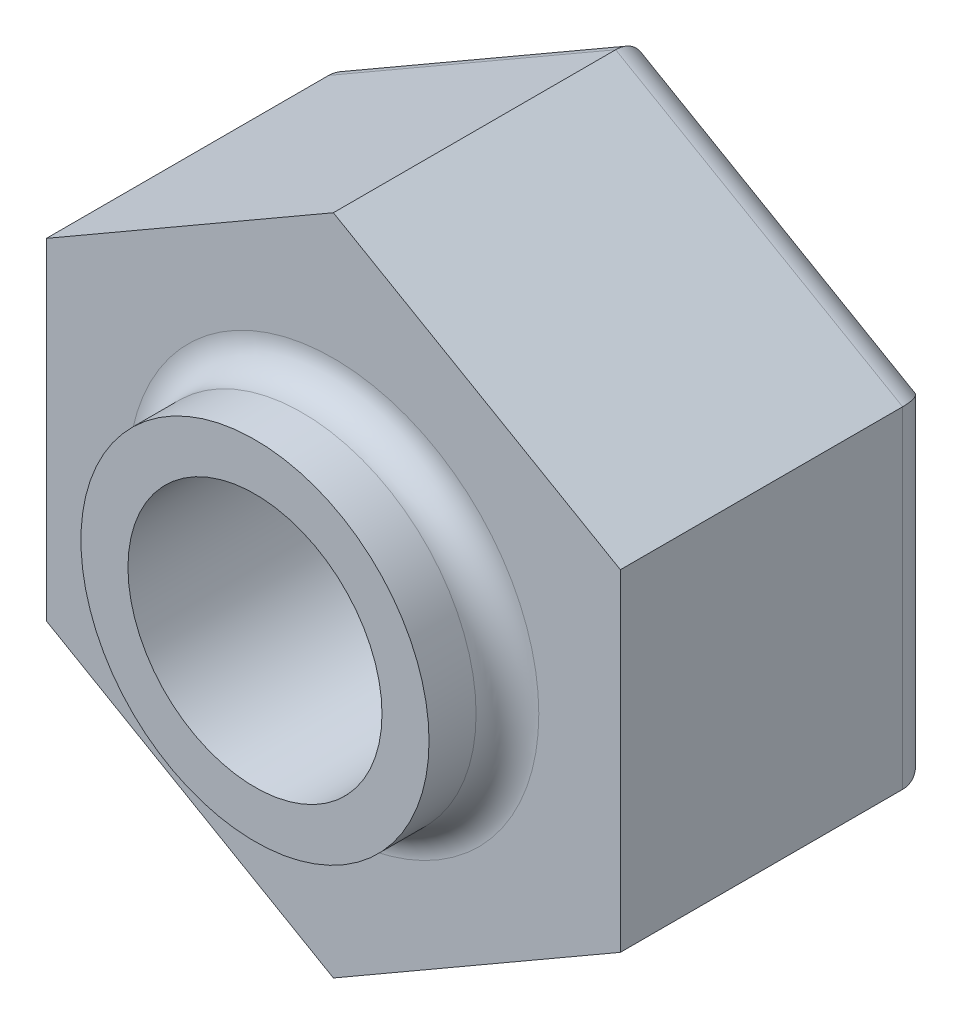
ISO-10303-21;
HEADER;
FILE_DESCRIPTION(('STEP AP214'),'2;1');
FILE_NAME('part.step','',(''),(''),'','','');
FILE_SCHEMA(('AUTOMOTIVE_DESIGN { 1 0 10303 214 1 1 1 1 }'));
ENDSEC;
DATA;
#1=APPLICATION_CONTEXT('core data for automotive mechanical design processes');
#2=APPLICATION_PROTOCOL_DEFINITION('international standard','automotive_design',2000,#1);
#3=PRODUCT_CONTEXT('',#1,'mechanical');
#4=PRODUCT('Part','Part','',(#3));
#5=PRODUCT_RELATED_PRODUCT_CATEGORY('part','',(#4));
#6=PRODUCT_DEFINITION_FORMATION('','',#4);
#7=PRODUCT_DEFINITION_CONTEXT('part definition',#1,'design');
#8=PRODUCT_DEFINITION('design','',#6,#7);
#9=PRODUCT_DEFINITION_SHAPE('','',#8);
#10=(LENGTH_UNIT() NAMED_UNIT(*) SI_UNIT(.MILLI.,.METRE.));
#11=(NAMED_UNIT(*) PLANE_ANGLE_UNIT() SI_UNIT($,.RADIAN.));
#12=(NAMED_UNIT(*) SI_UNIT($,.STERADIAN.) SOLID_ANGLE_UNIT());
#13=UNCERTAINTY_MEASURE_WITH_UNIT(LENGTH_MEASURE(1.E-05),#10,'distance_accuracy_value','');
#14=(GEOMETRIC_REPRESENTATION_CONTEXT(3) GLOBAL_UNCERTAINTY_ASSIGNED_CONTEXT((#13)) GLOBAL_UNIT_ASSIGNED_CONTEXT((#10,
#11,#12)) REPRESENTATION_CONTEXT('',''));
#15=CARTESIAN_POINT('',(0.,0.,0.));
#16=DIRECTION('',(0.,0.,1.));
#17=DIRECTION('',(1.,0.,0.));
#18=AXIS2_PLACEMENT_3D('',#15,#16,#17);
#19=CARTESIAN_POINT('',(0.,0.,10.));
#20=DIRECTION('',(0.,0.,1.));
#21=DIRECTION('',(1.,0.,0.));
#22=AXIS2_PLACEMENT_3D('',#19,#20,#21);
#23=PLANE('',#22);
#24=CARTESIAN_POINT('',(0.,0.,10.));
#25=DIRECTION('',(0.,0.,1.));
#26=DIRECTION('',(1.,0.,0.));
#27=AXIS2_PLACEMENT_3D('',#24,#25,#26);
#28=CIRCLE('',#27,6.55);
#29=CARTESIAN_POINT('',(6.55,0.,10.));
#30=VERTEX_POINT('',#29);
#31=EDGE_CURVE('E11',#30,#30,#28,.F.);
#32=ORIENTED_EDGE('',*,*,#31,.T.);
#33=EDGE_LOOP('',(#32));
#34=FACE_BOUND('',#33,.T.);
#35=DIRECTION('',(0.866025403784439,0.5,0.));
#36=VECTOR('',#35,1.);
#37=CARTESIAN_POINT('',(0.,-10.5655099261702,10.));
#38=LINE('',#37,#36);
#39=CARTESIAN_POINT('',(0.,-10.5655099261702,10.));
#40=VERTEX_POINT('',#39);
#41=CARTESIAN_POINT('',(9.15,-5.28275496308508,10.));
#42=VERTEX_POINT('',#41);
#43=EDGE_CURVE('E127',#40,#42,#38,.T.);
#44=ORIENTED_EDGE('',*,*,#43,.T.);
#45=DIRECTION('',(0.,1.,0.));
#46=VECTOR('',#45,1.);
#47=CARTESIAN_POINT('',(9.15,-5.28275496308508,10.));
#48=LINE('',#47,#46);
#49=CARTESIAN_POINT('',(9.15,5.28275496308508,10.));
#50=VERTEX_POINT('',#49);
#51=EDGE_CURVE('E115',#42,#50,#48,.T.);
#52=ORIENTED_EDGE('',*,*,#51,.T.);
#53=DIRECTION('',(-0.866025403784439,0.5,0.));
#54=VECTOR('',#53,1.);
#55=CARTESIAN_POINT('',(9.15,5.28275496308508,10.));
#56=LINE('',#55,#54);
#57=CARTESIAN_POINT('',(0.,10.5655099261702,10.));
#58=VERTEX_POINT('',#57);
#59=EDGE_CURVE('E126',#50,#58,#56,.T.);
#60=ORIENTED_EDGE('',*,*,#59,.T.);
#61=DIRECTION('',(-0.866025403784439,-0.5,0.));
#62=VECTOR('',#61,1.);
#63=CARTESIAN_POINT('',(0.,10.5655099261702,10.));
#64=LINE('',#63,#62);
#65=CARTESIAN_POINT('',(-9.15000000000001,5.28275496308508,10.));
#66=VERTEX_POINT('',#65);
#67=EDGE_CURVE('E201',#58,#66,#64,.T.);
#68=ORIENTED_EDGE('',*,*,#67,.T.);
#69=DIRECTION('',(0.,-1.,0.));
#70=VECTOR('',#69,1.);
#71=CARTESIAN_POINT('',(-9.15000000000001,5.28275496308508,10.));
#72=LINE('',#71,#70);
#73=CARTESIAN_POINT('',(-9.15,-5.28275496308508,10.));
#74=VERTEX_POINT('',#73);
#75=EDGE_CURVE('E203',#66,#74,#72,.T.);
#76=ORIENTED_EDGE('',*,*,#75,.T.);
#77=DIRECTION('',(0.866025403784438,-0.5,0.));
#78=VECTOR('',#77,1.);
#79=CARTESIAN_POINT('',(-9.15,-5.28275496308508,10.));
#80=LINE('',#79,#78);
#81=EDGE_CURVE('E131',#74,#40,#80,.T.);
#82=ORIENTED_EDGE('',*,*,#81,.T.);
#83=EDGE_LOOP('',(#44,#52,#60,#68,#76,#82));
#84=FACE_BOUND('',#83,.T.);
#85=ADVANCED_FACE('F39',(#34,#84),#23,.T.);
#86=CARTESIAN_POINT('',(0.,0.,0.));
#87=DIRECTION('',(0.,0.,1.));
#88=DIRECTION('',(1.,0.,0.));
#89=AXIS2_PLACEMENT_3D('',#86,#87,#88);
#90=PLANE('',#89);
#91=CARTESIAN_POINT('',(0.,0.,0.));
#92=DIRECTION('',(0.,0.,1.));
#93=DIRECTION('',(1.,0.,0.));
#94=AXIS2_PLACEMENT_3D('',#91,#92,#93);
#95=CIRCLE('',#94,5.05);
#96=CARTESIAN_POINT('',(5.05,0.,0.));
#97=VERTEX_POINT('',#96);
#98=EDGE_CURVE('E156',#97,#97,#95,.T.);
#99=ORIENTED_EDGE('',*,*,#98,.T.);
#100=EDGE_LOOP('',(#99));
#101=FACE_BOUND('',#100,.T.);
#102=DIRECTION('',(-0.866025403784439,0.5,0.));
#103=VECTOR('',#102,1.);
#104=CARTESIAN_POINT('',(4.075,7.05810704084318,0.));
#105=LINE('',#104,#103);
#106=CARTESIAN_POINT('',(0.,9.41080938779091,0.));
#107=VERTEX_POINT('',#106);
#108=CARTESIAN_POINT('',(8.15,4.70540469389546,0.));
#109=VERTEX_POINT('',#108);
#110=EDGE_CURVE('E151',#107,#109,#105,.F.);
#111=ORIENTED_EDGE('',*,*,#110,.T.);
#112=DIRECTION('',(0.,1.,0.));
#113=VECTOR('',#112,1.);
#114=CARTESIAN_POINT('',(8.15,0.,0.));
#115=LINE('',#114,#113);
#116=CARTESIAN_POINT('',(8.15,-4.70540469389545,0.));
#117=VERTEX_POINT('',#116);
#118=EDGE_CURVE('E153',#109,#117,#115,.F.);
#119=ORIENTED_EDGE('',*,*,#118,.T.);
#120=DIRECTION('',(0.866025403784439,0.5,0.));
#121=VECTOR('',#120,1.);
#122=CARTESIAN_POINT('',(4.075,-7.05810704084318,0.));
#123=LINE('',#122,#121);
#124=CARTESIAN_POINT('',(0.,-9.4108093877909,0.));
#125=VERTEX_POINT('',#124);
#126=EDGE_CURVE('E138',#117,#125,#123,.F.);
#127=ORIENTED_EDGE('',*,*,#126,.T.);
#128=DIRECTION('',(0.866025403784439,-0.5,0.));
#129=VECTOR('',#128,1.);
#130=CARTESIAN_POINT('',(-4.075,-7.05810704084318,0.));
#131=LINE('',#130,#129);
#132=CARTESIAN_POINT('',(-8.15,-4.70540469389545,0.));
#133=VERTEX_POINT('',#132);
#134=EDGE_CURVE('E140',#125,#133,#131,.F.);
#135=ORIENTED_EDGE('',*,*,#134,.T.);
#136=DIRECTION('',(0.,-1.,0.));
#137=VECTOR('',#136,1.);
#138=CARTESIAN_POINT('',(-8.15,0.,0.));
#139=LINE('',#138,#137);
#140=CARTESIAN_POINT('',(-8.15,4.70540469389546,0.));
#141=VERTEX_POINT('',#140);
#142=EDGE_CURVE('E147',#133,#141,#139,.F.);
#143=ORIENTED_EDGE('',*,*,#142,.T.);
#144=DIRECTION('',(-0.866025403784439,-0.5,0.));
#145=VECTOR('',#144,1.);
#146=CARTESIAN_POINT('',(-4.075,7.05810704084318,0.));
#147=LINE('',#146,#145);
#148=EDGE_CURVE('E149',#141,#107,#147,.F.);
#149=ORIENTED_EDGE('',*,*,#148,.T.);
#150=EDGE_LOOP('',(#111,#119,#127,#135,#143,#149));
#151=FACE_BOUND('',#150,.T.);
#152=ADVANCED_FACE('F227',(#101,#151),#90,.F.);
#153=CARTESIAN_POINT('',(0.,-10.5655099261702,10.));
#154=DIRECTION('',(-0.5,0.866025403784439,0.));
#155=DIRECTION('',(-0.866025403784439,-0.5,0.));
#156=AXIS2_PLACEMENT_3D('',#153,#154,#155);
#157=PLANE('',#156);
#158=DIRECTION('',(0.,0.,-1.));
#159=VECTOR('',#158,1.);
#160=CARTESIAN_POINT('',(0.,-10.5655099261702,10.));
#161=LINE('',#160,#159);
#162=CARTESIAN_POINT('',(0.,-10.5655099261702,0.999999999999999));
#163=VERTEX_POINT('',#162);
#164=EDGE_CURVE('E206',#40,#163,#161,.T.);
#165=ORIENTED_EDGE('',*,*,#164,.T.);
#166=DIRECTION('',(0.866025403784439,0.5,0.));
#167=VECTOR('',#166,1.);
#168=CARTESIAN_POINT('',(0.,-10.5655099261702,0.999999999999999));
#169=LINE('',#168,#167);
#170=CARTESIAN_POINT('',(9.15,-5.28275496308508,0.999999999999999));
#171=VERTEX_POINT('',#170);
#172=EDGE_CURVE('E137',#163,#171,#169,.T.);
#173=ORIENTED_EDGE('',*,*,#172,.T.);
#174=DIRECTION('',(0.,0.,-1.));
#175=VECTOR('',#174,1.);
#176=CARTESIAN_POINT('',(9.15,-5.28275496308508,10.));
#177=LINE('',#176,#175);
#178=EDGE_CURVE('E120',#42,#171,#177,.T.);
#179=ORIENTED_EDGE('',*,*,#178,.F.);
#180=ORIENTED_EDGE('',*,*,#43,.F.);
#181=EDGE_LOOP('',(#165,#173,#179,#180));
#182=FACE_BOUND('',#181,.T.);
#183=ADVANCED_FACE('F135',(#182),#157,.F.);
#184=CARTESIAN_POINT('',(9.15,-5.28275496308508,10.));
#185=DIRECTION('',(-1.,0.,0.));
#186=DIRECTION('',(0.,0.,1.));
#187=AXIS2_PLACEMENT_3D('',#184,#185,#186);
#188=PLANE('',#187);
#189=ORIENTED_EDGE('',*,*,#178,.T.);
#190=DIRECTION('',(0.,1.,0.));
#191=VECTOR('',#190,1.);
#192=CARTESIAN_POINT('',(9.15,-5.28275496308508,0.999999999999999));
#193=LINE('',#192,#191);
#194=CARTESIAN_POINT('',(9.15,5.28275496308508,0.999999999999999));
#195=VERTEX_POINT('',#194);
#196=EDGE_CURVE('E162',#171,#195,#193,.T.);
#197=ORIENTED_EDGE('',*,*,#196,.T.);
#198=DIRECTION('',(0.,0.,-1.));
#199=VECTOR('',#198,1.);
#200=CARTESIAN_POINT('',(9.15,5.28275496308508,10.));
#201=LINE('',#200,#199);
#202=EDGE_CURVE('E123',#50,#195,#201,.T.);
#203=ORIENTED_EDGE('',*,*,#202,.F.);
#204=ORIENTED_EDGE('',*,*,#51,.F.);
#205=EDGE_LOOP('',(#189,#197,#203,#204));
#206=FACE_BOUND('',#205,.T.);
#207=ADVANCED_FACE('F117',(#206),#188,.F.);
#208=CARTESIAN_POINT('',(9.15,5.28275496308508,10.));
#209=DIRECTION('',(-0.5,-0.866025403784439,0.));
#210=DIRECTION('',(0.866025403784439,-0.5,0.));
#211=AXIS2_PLACEMENT_3D('',#208,#209,#210);
#212=PLANE('',#211);
#213=ORIENTED_EDGE('',*,*,#202,.T.);
#214=DIRECTION('',(-0.866025403784439,0.5,0.));
#215=VECTOR('',#214,1.);
#216=CARTESIAN_POINT('',(9.15,5.28275496308508,0.999999999999999));
#217=LINE('',#216,#215);
#218=CARTESIAN_POINT('',(0.,10.5655099261702,0.999999999999999));
#219=VERTEX_POINT('',#218);
#220=EDGE_CURVE('E164',#195,#219,#217,.T.);
#221=ORIENTED_EDGE('',*,*,#220,.T.);
#222=DIRECTION('',(0.,0.,-1.));
#223=VECTOR('',#222,1.);
#224=CARTESIAN_POINT('',(0.,10.5655099261702,10.));
#225=LINE('',#224,#223);
#226=EDGE_CURVE('E142',#58,#219,#225,.T.);
#227=ORIENTED_EDGE('',*,*,#226,.F.);
#228=ORIENTED_EDGE('',*,*,#59,.F.);
#229=EDGE_LOOP('',(#213,#221,#227,#228));
#230=FACE_BOUND('',#229,.T.);
#231=ADVANCED_FACE('F267',(#230),#212,.F.);
#232=CARTESIAN_POINT('',(0.,10.5655099261702,10.));
#233=DIRECTION('',(0.5,-0.866025403784439,0.));
#234=DIRECTION('',(0.866025403784439,0.5,0.));
#235=AXIS2_PLACEMENT_3D('',#232,#233,#234);
#236=PLANE('',#235);
#237=ORIENTED_EDGE('',*,*,#226,.T.);
#238=DIRECTION('',(-0.866025403784439,-0.5,0.));
#239=VECTOR('',#238,1.);
#240=CARTESIAN_POINT('',(0.,10.5655099261702,0.999999999999999));
#241=LINE('',#240,#239);
#242=CARTESIAN_POINT('',(-9.15000000000001,5.28275496308508,0.999999999999999));
#243=VERTEX_POINT('',#242);
#244=EDGE_CURVE('E166',#219,#243,#241,.T.);
#245=ORIENTED_EDGE('',*,*,#244,.T.);
#246=DIRECTION('',(0.,0.,-1.));
#247=VECTOR('',#246,1.);
#248=CARTESIAN_POINT('',(-9.15000000000001,5.28275496308508,10.));
#249=LINE('',#248,#247);
#250=EDGE_CURVE('E210',#66,#243,#249,.T.);
#251=ORIENTED_EDGE('',*,*,#250,.F.);
#252=ORIENTED_EDGE('',*,*,#67,.F.);
#253=EDGE_LOOP('',(#237,#245,#251,#252));
#254=FACE_BOUND('',#253,.T.);
#255=ADVANCED_FACE('F215',(#254),#236,.F.);
#256=CARTESIAN_POINT('',(-9.15000000000001,5.28275496308508,10.));
#257=DIRECTION('',(1.,0.,0.));
#258=DIRECTION('',(0.,1.,0.));
#259=AXIS2_PLACEMENT_3D('',#256,#257,#258);
#260=PLANE('',#259);
#261=ORIENTED_EDGE('',*,*,#250,.T.);
#262=DIRECTION('',(0.,-1.,0.));
#263=VECTOR('',#262,1.);
#264=CARTESIAN_POINT('',(-9.15000000000001,5.28275496308508,0.999999999999999));
#265=LINE('',#264,#263);
#266=CARTESIAN_POINT('',(-9.15,-5.28275496308508,0.999999999999999));
#267=VERTEX_POINT('',#266);
#268=EDGE_CURVE('E64',#243,#267,#265,.T.);
#269=ORIENTED_EDGE('',*,*,#268,.T.);
#270=DIRECTION('',(0.,0.,-1.));
#271=VECTOR('',#270,1.);
#272=CARTESIAN_POINT('',(-9.15,-5.28275496308508,10.));
#273=LINE('',#272,#271);
#274=EDGE_CURVE('E208',#74,#267,#273,.T.);
#275=ORIENTED_EDGE('',*,*,#274,.F.);
#276=ORIENTED_EDGE('',*,*,#75,.F.);
#277=EDGE_LOOP('',(#261,#269,#275,#276));
#278=FACE_BOUND('',#277,.T.);
#279=ADVANCED_FACE('F262',(#278),#260,.F.);
#280=CARTESIAN_POINT('',(-9.15,-5.28275496308508,10.));
#281=DIRECTION('',(0.5,0.866025403784439,0.));
#282=DIRECTION('',(-0.866025403784439,0.5,0.));
#283=AXIS2_PLACEMENT_3D('',#280,#281,#282);
#284=PLANE('',#283);
#285=ORIENTED_EDGE('',*,*,#274,.T.);
#286=DIRECTION('',(0.866025403784439,-0.5,0.));
#287=VECTOR('',#286,1.);
#288=CARTESIAN_POINT('',(-9.15,-5.28275496308508,0.999999999999999));
#289=LINE('',#288,#287);
#290=EDGE_CURVE('E56',#267,#163,#289,.T.);
#291=ORIENTED_EDGE('',*,*,#290,.T.);
#292=ORIENTED_EDGE('',*,*,#164,.F.);
#293=ORIENTED_EDGE('',*,*,#81,.F.);
#294=EDGE_LOOP('',(#285,#291,#292,#293));
#295=FACE_BOUND('',#294,.T.);
#296=ADVANCED_FACE('F259',(#295),#284,.F.);
#297=CARTESIAN_POINT('',(0.,0.,10.));
#298=DIRECTION('',(0.,0.,-1.));
#299=DIRECTION('',(-1.,0.,0.));
#300=AXIS2_PLACEMENT_3D('',#297,#298,#299);
#301=CYLINDRICAL_SURFACE('',#300,4.05);
#302=CARTESIAN_POINT('',(0.,0.,0.999999999999999));
#303=DIRECTION('',(0.,0.,1.));
#304=DIRECTION('',(1.,0.,0.));
#305=AXIS2_PLACEMENT_3D('',#302,#303,#304);
#306=CIRCLE('',#305,4.05);
#307=CARTESIAN_POINT('',(4.05,0.,0.999999999999999));
#308=VERTEX_POINT('',#307);
#309=EDGE_CURVE('E159',#308,#308,#306,.F.);
#310=ORIENTED_EDGE('',*,*,#309,.T.);
#311=EDGE_LOOP('',(#310));
#312=FACE_BOUND('',#311,.T.);
#313=CARTESIAN_POINT('',(0.,0.,12.5));
#314=DIRECTION('',(0.,0.,1.));
#315=DIRECTION('',(1.,0.,0.));
#316=AXIS2_PLACEMENT_3D('',#313,#314,#315);
#317=CIRCLE('',#316,4.05);
#318=CARTESIAN_POINT('',(4.05,0.,12.5));
#319=VERTEX_POINT('',#318);
#320=EDGE_CURVE('E189',#319,#319,#317,.F.);
#321=ORIENTED_EDGE('',*,*,#320,.F.);
#322=EDGE_LOOP('',(#321));
#323=FACE_BOUND('',#322,.T.);
#324=ADVANCED_FACE('F256',(#312,#323),#301,.F.);
#325=CARTESIAN_POINT('',(0.,0.,12.5));
#326=DIRECTION('',(0.,0.,-1.));
#327=DIRECTION('',(-1.,0.,0.));
#328=AXIS2_PLACEMENT_3D('',#325,#326,#327);
#329=CYLINDRICAL_SURFACE('',#328,5.55);
#330=CARTESIAN_POINT('',(0.,0.,11.));
#331=DIRECTION('',(0.,0.,1.));
#332=DIRECTION('',(1.,0.,0.));
#333=AXIS2_PLACEMENT_3D('',#330,#331,#332);
#334=CIRCLE('',#333,5.55);
#335=CARTESIAN_POINT('',(5.55,0.,11.));
#336=VERTEX_POINT('',#335);
#337=EDGE_CURVE('E48',#336,#336,#334,.T.);
#338=ORIENTED_EDGE('',*,*,#337,.T.);
#339=EDGE_LOOP('',(#338));
#340=FACE_BOUND('',#339,.T.);
#341=CARTESIAN_POINT('',(0.,0.,12.5));
#342=DIRECTION('',(0.,0.,1.));
#343=DIRECTION('',(1.,0.,0.));
#344=AXIS2_PLACEMENT_3D('',#341,#342,#343);
#345=CIRCLE('',#344,5.55);
#346=CARTESIAN_POINT('',(5.55,0.,12.5));
#347=VERTEX_POINT('',#346);
#348=EDGE_CURVE('E133',#347,#347,#345,.T.);
#349=ORIENTED_EDGE('',*,*,#348,.F.);
#350=EDGE_LOOP('',(#349));
#351=FACE_BOUND('',#350,.T.);
#352=ADVANCED_FACE('F353',(#340,#351),#329,.T.);
#353=CARTESIAN_POINT('',(0.,0.,12.5));
#354=DIRECTION('',(0.,0.,1.));
#355=DIRECTION('',(1.,0.,0.));
#356=AXIS2_PLACEMENT_3D('',#353,#354,#355);
#357=PLANE('',#356);
#358=ORIENTED_EDGE('',*,*,#320,.T.);
#359=EDGE_LOOP('',(#358));
#360=FACE_BOUND('',#359,.T.);
#361=ORIENTED_EDGE('',*,*,#348,.T.);
#362=EDGE_LOOP('',(#361));
#363=FACE_BOUND('',#362,.T.);
#364=ADVANCED_FACE('F276',(#360,#363),#357,.T.);
#365=CARTESIAN_POINT('',(0.,0.,0.999999999999999));
#366=DIRECTION('',(0.,0.,1.));
#367=DIRECTION('',(1.,0.,0.));
#368=AXIS2_PLACEMENT_3D('',#365,#366,#367);
#369=TOROIDAL_SURFACE('',#368,5.05,1.);
#370=ORIENTED_EDGE('',*,*,#309,.F.);
#371=EDGE_LOOP('',(#370));
#372=FACE_BOUND('',#371,.T.);
#373=ORIENTED_EDGE('',*,*,#98,.F.);
#374=EDGE_LOOP('',(#373));
#375=FACE_BOUND('',#374,.T.);
#376=ADVANCED_FACE('F245',(#372,#375),#369,.T.);
#377=CARTESIAN_POINT('',(-8.15,5.28275496308508,0.999999999999999));
#378=DIRECTION('',(0.,-1.,0.));
#379=DIRECTION('',(1.,0.,0.));
#380=AXIS2_PLACEMENT_3D('',#377,#378,#379);
#381=CYLINDRICAL_SURFACE('',#380,1.);
#382=CARTESIAN_POINT('',(-8.15000000000001,4.70540469389545,0.999999999999999));
#383=DIRECTION('',(-0.5,-0.866025403784439,0.));
#384=DIRECTION('',(0.866025403784439,-0.5,0.));
#385=AXIS2_PLACEMENT_3D('',#382,#383,#384);
#386=ELLIPSE('',#385,1.15470053837925,1.);
#387=EDGE_CURVE('E182',#141,#243,#386,.F.);
#388=ORIENTED_EDGE('',*,*,#387,.F.);
#389=ORIENTED_EDGE('',*,*,#142,.F.);
#390=CARTESIAN_POINT('',(-8.15,-4.70540469389545,0.999999999999999));
#391=DIRECTION('',(0.5,-0.866025403784439,0.));
#392=DIRECTION('',(0.866025403784439,0.5,0.));
#393=AXIS2_PLACEMENT_3D('',#390,#391,#392);
#394=ELLIPSE('',#393,1.15470053837925,1.);
#395=EDGE_CURVE('E43',#267,#133,#394,.T.);
#396=ORIENTED_EDGE('',*,*,#395,.F.);
#397=ORIENTED_EDGE('',*,*,#268,.F.);
#398=EDGE_LOOP('',(#388,#389,#396,#397));
#399=FACE_BOUND('',#398,.T.);
#400=ADVANCED_FACE('F238',(#399),#381,.T.);
#401=CARTESIAN_POINT('',(-8.65,-4.41672955930064,0.999999999999999));
#402=DIRECTION('',(0.866025403784439,-0.5,0.));
#403=DIRECTION('',(0.5,0.866025403784439,0.));
#404=AXIS2_PLACEMENT_3D('',#401,#402,#403);
#405=CYLINDRICAL_SURFACE('',#404,1.);
#406=ORIENTED_EDGE('',*,*,#395,.T.);
#407=ORIENTED_EDGE('',*,*,#134,.F.);
#408=CARTESIAN_POINT('',(0.,-9.4108093877909,0.999999999999999));
#409=DIRECTION('',(1.,0.,0.));
#410=DIRECTION('',(0.,1.,0.));
#411=AXIS2_PLACEMENT_3D('',#408,#409,#410);
#412=ELLIPSE('',#411,1.15470053837925,1.);
#413=EDGE_CURVE('E180',#163,#125,#412,.T.);
#414=ORIENTED_EDGE('',*,*,#413,.F.);
#415=ORIENTED_EDGE('',*,*,#290,.F.);
#416=EDGE_LOOP('',(#406,#407,#414,#415));
#417=FACE_BOUND('',#416,.T.);
#418=ADVANCED_FACE('F236',(#417),#405,.T.);
#419=CARTESIAN_POINT('',(0.499999999999996,9.69948452238572,0.999999999999999));
#420=DIRECTION('',(-0.866025403784439,-0.5,0.));
#421=DIRECTION('',(0.5,-0.866025403784439,0.));
#422=AXIS2_PLACEMENT_3D('',#419,#420,#421);
#423=CYLINDRICAL_SURFACE('',#422,1.);
#424=ORIENTED_EDGE('',*,*,#387,.T.);
#425=ORIENTED_EDGE('',*,*,#244,.F.);
#426=CARTESIAN_POINT('',(0.,9.41080938779091,0.999999999999999));
#427=DIRECTION('',(-1.,0.,0.));
#428=DIRECTION('',(0.,-1.,0.));
#429=AXIS2_PLACEMENT_3D('',#426,#427,#428);
#430=ELLIPSE('',#429,1.15470053837925,1.);
#431=EDGE_CURVE('E177',#107,#219,#430,.F.);
#432=ORIENTED_EDGE('',*,*,#431,.F.);
#433=ORIENTED_EDGE('',*,*,#148,.F.);
#434=EDGE_LOOP('',(#424,#425,#432,#433));
#435=FACE_BOUND('',#434,.T.);
#436=ADVANCED_FACE('F219',(#435),#423,.T.);
#437=CARTESIAN_POINT('',(-0.5,-9.69948452238572,0.999999999999999));
#438=DIRECTION('',(0.866025403784439,0.5,0.));
#439=DIRECTION('',(-0.5,0.866025403784439,0.));
#440=AXIS2_PLACEMENT_3D('',#437,#438,#439);
#441=CYLINDRICAL_SURFACE('',#440,1.);
#442=ORIENTED_EDGE('',*,*,#413,.T.);
#443=ORIENTED_EDGE('',*,*,#126,.F.);
#444=CARTESIAN_POINT('',(8.15,-4.70540469389545,0.999999999999999));
#445=DIRECTION('',(0.5,0.866025403784439,0.));
#446=DIRECTION('',(0.866025403784439,-0.5,0.));
#447=AXIS2_PLACEMENT_3D('',#444,#445,#446);
#448=ELLIPSE('',#447,1.15470053837925,1.);
#449=EDGE_CURVE('E175',#171,#117,#448,.T.);
#450=ORIENTED_EDGE('',*,*,#449,.F.);
#451=ORIENTED_EDGE('',*,*,#172,.F.);
#452=EDGE_LOOP('',(#442,#443,#450,#451));
#453=FACE_BOUND('',#452,.T.);
#454=ADVANCED_FACE('F233',(#453),#441,.T.);
#455=CARTESIAN_POINT('',(8.65,4.41672955930064,0.999999999999999));
#456=DIRECTION('',(-0.866025403784439,0.5,0.));
#457=DIRECTION('',(-0.5,-0.866025403784439,0.));
#458=AXIS2_PLACEMENT_3D('',#455,#456,#457);
#459=CYLINDRICAL_SURFACE('',#458,1.);
#460=ORIENTED_EDGE('',*,*,#431,.T.);
#461=ORIENTED_EDGE('',*,*,#220,.F.);
#462=CARTESIAN_POINT('',(8.15,4.70540469389545,0.999999999999999));
#463=DIRECTION('',(-0.5,0.866025403784439,0.));
#464=DIRECTION('',(-0.866025403784439,-0.5,0.));
#465=AXIS2_PLACEMENT_3D('',#462,#463,#464);
#466=ELLIPSE('',#465,1.15470053837925,1.);
#467=EDGE_CURVE('E173',#109,#195,#466,.F.);
#468=ORIENTED_EDGE('',*,*,#467,.F.);
#469=ORIENTED_EDGE('',*,*,#110,.F.);
#470=EDGE_LOOP('',(#460,#461,#468,#469));
#471=FACE_BOUND('',#470,.T.);
#472=ADVANCED_FACE('F223',(#471),#459,.T.);
#473=CARTESIAN_POINT('',(8.15,-5.28275496308508,0.999999999999999));
#474=DIRECTION('',(0.,1.,0.));
#475=DIRECTION('',(0.,0.,1.));
#476=AXIS2_PLACEMENT_3D('',#473,#474,#475);
#477=CYLINDRICAL_SURFACE('',#476,1.);
#478=ORIENTED_EDGE('',*,*,#449,.T.);
#479=ORIENTED_EDGE('',*,*,#118,.F.);
#480=ORIENTED_EDGE('',*,*,#467,.T.);
#481=ORIENTED_EDGE('',*,*,#196,.F.);
#482=EDGE_LOOP('',(#478,#479,#480,#481));
#483=FACE_BOUND('',#482,.T.);
#484=ADVANCED_FACE('F229',(#483),#477,.T.);
#485=CARTESIAN_POINT('',(0.,0.,11.));
#486=DIRECTION('',(0.,0.,1.));
#487=DIRECTION('',(1.,0.,0.));
#488=AXIS2_PLACEMENT_3D('',#485,#486,#487);
#489=TOROIDAL_SURFACE('',#488,6.55,1.);
#490=ORIENTED_EDGE('',*,*,#31,.F.);
#491=EDGE_LOOP('',(#490));
#492=FACE_BOUND('',#491,.T.);
#493=ORIENTED_EDGE('',*,*,#337,.F.);
#494=EDGE_LOOP('',(#493));
#495=FACE_BOUND('',#494,.T.);
#496=ADVANCED_FACE('F41',(#492,#495),#489,.F.);
#497=CLOSED_SHELL('',(#85,#152,#183,#207,#231,#255,#279,#296,#324,#352,#364,#376,#400,#418,#436,
#454,#472,#484,#496));
#498=MANIFOLD_SOLID_BREP('B2',#497);
#499=ADVANCED_BREP_SHAPE_REPRESENTATION('',(#18,#498),#14);
#500=SHAPE_DEFINITION_REPRESENTATION(#9,#499);
ENDSEC;
END-ISO-10303-21;
